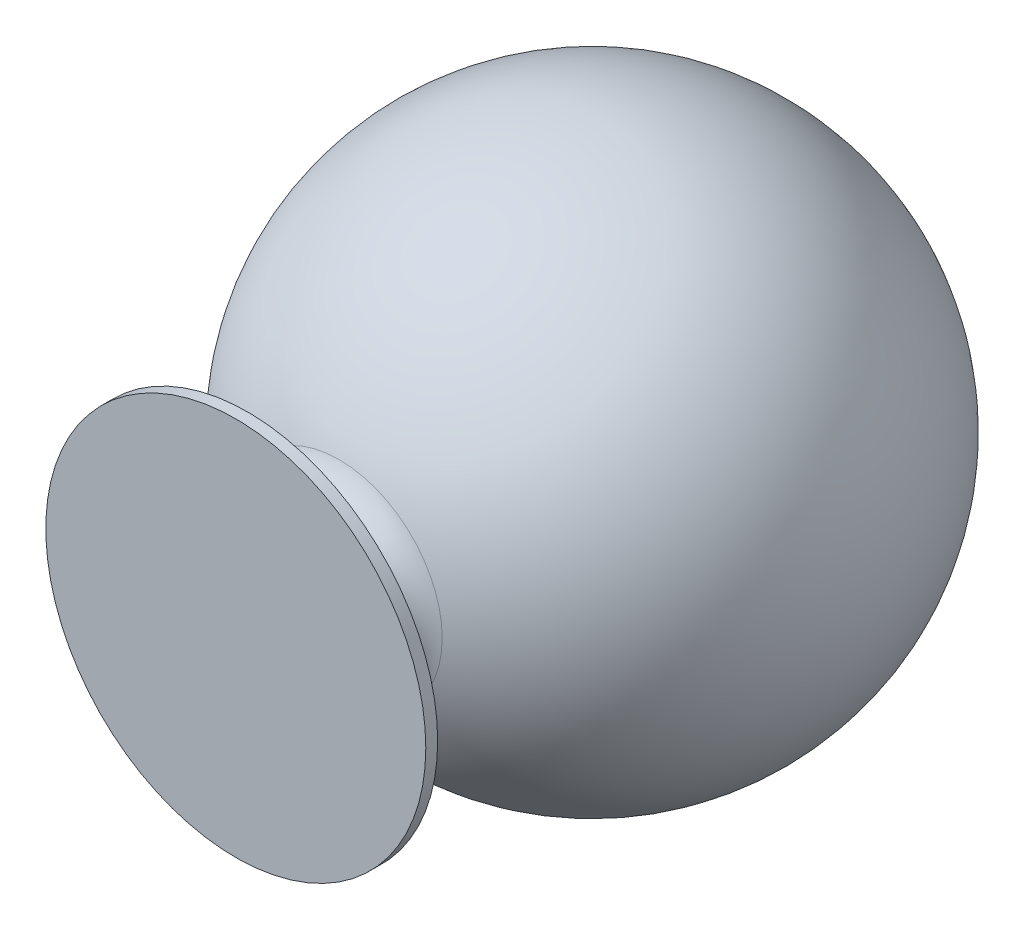
ISO-10303-21;
HEADER;
FILE_DESCRIPTION(('STEP AP214'),'2;1');
FILE_NAME('part.step','',(''),(''),'','','');
FILE_SCHEMA(('AUTOMOTIVE_DESIGN { 1 0 10303 214 1 1 1 1 }'));
ENDSEC;
DATA;
#1=APPLICATION_CONTEXT('core data for automotive mechanical design processes');
#2=APPLICATION_PROTOCOL_DEFINITION('international standard','automotive_design',2000,#1);
#3=PRODUCT_CONTEXT('',#1,'mechanical');
#4=PRODUCT('Part','Part','',(#3));
#5=PRODUCT_RELATED_PRODUCT_CATEGORY('part','',(#4));
#6=PRODUCT_DEFINITION_FORMATION('','',#4);
#7=PRODUCT_DEFINITION_CONTEXT('part definition',#1,'design');
#8=PRODUCT_DEFINITION('design','',#6,#7);
#9=PRODUCT_DEFINITION_SHAPE('','',#8);
#10=(LENGTH_UNIT() NAMED_UNIT(*) SI_UNIT(.MILLI.,.METRE.));
#11=(NAMED_UNIT(*) PLANE_ANGLE_UNIT() SI_UNIT($,.RADIAN.));
#12=(NAMED_UNIT(*) SI_UNIT($,.STERADIAN.) SOLID_ANGLE_UNIT());
#13=UNCERTAINTY_MEASURE_WITH_UNIT(LENGTH_MEASURE(1.E-05),#10,'distance_accuracy_value','');
#14=(GEOMETRIC_REPRESENTATION_CONTEXT(3) GLOBAL_UNCERTAINTY_ASSIGNED_CONTEXT((#13)) GLOBAL_UNIT_ASSIGNED_CONTEXT((#10,
#11,#12)) REPRESENTATION_CONTEXT('',''));
#15=CARTESIAN_POINT('',(0.,0.,0.));
#16=DIRECTION('',(0.,0.,1.));
#17=DIRECTION('',(1.,0.,0.));
#18=AXIS2_PLACEMENT_3D('',#15,#16,#17);
#19=CARTESIAN_POINT('',(0.,0.,0.));
#20=DIRECTION('',(0.,0.,1.));
#21=DIRECTION('',(-1.,0.,0.));
#22=AXIS2_PLACEMENT_3D('',#19,#20,#21);
#23=SPHERICAL_SURFACE('',#22,23.);
#24=CARTESIAN_POINT('',(0.,0.,21.2995469744592));
#25=DIRECTION('',(0.,0.,1.));
#26=DIRECTION('',(1.,0.,0.));
#27=AXIS2_PLACEMENT_3D('',#24,#25,#26);
#28=CIRCLE('',#27,8.67924528301887);
#29=CARTESIAN_POINT('',(8.67924528301887,0.,21.2995469744592));
#30=VERTEX_POINT('',#29);
#31=EDGE_CURVE('E10',#30,#30,#28,.T.);
#32=ORIENTED_EDGE('',*,*,#31,.F.);
#33=EDGE_LOOP('',(#32));
#34=FACE_BOUND('',#33,.T.);
#35=ADVANCED_FACE('F29',(#34),#23,.T.);
#36=CARTESIAN_POINT('',(0.,0.,24.5407823836161));
#37=DIRECTION('',(0.,0.,1.));
#38=DIRECTION('',(1.,0.,0.));
#39=AXIS2_PLACEMENT_3D('',#36,#37,#38);
#40=TOROIDAL_SURFACE('',#39,10.,3.5);
#41=CARTESIAN_POINT('',(0.,0.,27.8663329828295));
#42=DIRECTION('',(0.,0.,1.));
#43=DIRECTION('',(1.,0.,0.));
#44=AXIS2_PLACEMENT_3D('',#41,#42,#43);
#45=CIRCLE('',#44,8.90880193728576);
#46=CARTESIAN_POINT('',(8.90880193728576,0.,27.8663329828295));
#47=VERTEX_POINT('',#46);
#48=EDGE_CURVE('E35',#47,#47,#45,.T.);
#49=ORIENTED_EDGE('',*,*,#48,.F.);
#50=EDGE_LOOP('',(#49));
#51=FACE_BOUND('',#50,.T.);
#52=ORIENTED_EDGE('',*,*,#31,.T.);
#53=EDGE_LOOP('',(#52));
#54=FACE_BOUND('',#53,.T.);
#55=ADVANCED_FACE('F59',(#51,#54),#40,.F.);
#56=CARTESIAN_POINT('',(0.,0.,6.25509779795185));
#57=DIRECTION('',(0.,0.,1.));
#58=DIRECTION('',(1.,0.,0.));
#59=AXIS2_PLACEMENT_3D('',#56,#57,#58);
#60=DEGENERATE_TOROIDAL_SURFACE('',#59,16.,22.7449022020481,.T.);
#61=CARTESIAN_POINT('',(0.,0.,29.));
#62=DIRECTION('',(0.,0.,1.));
#63=DIRECTION('',(1.,0.,0.));
#64=AXIS2_PLACEMENT_3D('',#61,#62,#63);
#65=CIRCLE('',#64,16.);
#66=CARTESIAN_POINT('',(16.,0.,29.));
#67=VERTEX_POINT('',#66);
#68=EDGE_CURVE('E39',#67,#67,#65,.T.);
#69=ORIENTED_EDGE('',*,*,#68,.F.);
#70=EDGE_LOOP('',(#69));
#71=FACE_BOUND('',#70,.T.);
#72=ORIENTED_EDGE('',*,*,#48,.T.);
#73=EDGE_LOOP('',(#72));
#74=FACE_BOUND('',#73,.T.);
#75=ADVANCED_FACE('F54',(#71,#74),#60,.F.);
#76=CARTESIAN_POINT('',(0.,0.,29.938830715533));
#77=DIRECTION('',(0.,0.,1.));
#78=DIRECTION('',(1.,0.,0.));
#79=AXIS2_PLACEMENT_3D('',#76,#77,#78);
#80=CYLINDRICAL_SURFACE('',#79,16.);
#81=CARTESIAN_POINT('',(0.,0.,30.));
#82=DIRECTION('',(0.,0.,1.));
#83=DIRECTION('',(1.,0.,0.));
#84=AXIS2_PLACEMENT_3D('',#81,#82,#83);
#85=CIRCLE('',#84,16.);
#86=CARTESIAN_POINT('',(16.,0.,30.));
#87=VERTEX_POINT('',#86);
#88=EDGE_CURVE('E43',#87,#87,#85,.T.);
#89=ORIENTED_EDGE('',*,*,#88,.F.);
#90=EDGE_LOOP('',(#89));
#91=FACE_BOUND('',#90,.T.);
#92=ORIENTED_EDGE('',*,*,#68,.T.);
#93=EDGE_LOOP('',(#92));
#94=FACE_BOUND('',#93,.T.);
#95=ADVANCED_FACE('F51',(#91,#94),#80,.T.);
#96=CARTESIAN_POINT('',(-16.,0.,30.));
#97=DIRECTION('',(0.,0.,-1.));
#98=DIRECTION('',(-1.,0.,0.));
#99=AXIS2_PLACEMENT_3D('',#96,#97,#98);
#100=PLANE('',#99);
#101=ORIENTED_EDGE('',*,*,#88,.T.);
#102=EDGE_LOOP('',(#101));
#103=FACE_BOUND('',#102,.T.);
#104=ADVANCED_FACE('F49',(#103),#100,.F.);
#105=CLOSED_SHELL('',(#35,#55,#75,#95,#104));
#106=MANIFOLD_SOLID_BREP('B2',#105);
#107=ADVANCED_BREP_SHAPE_REPRESENTATION('',(#18,#106),#14);
#108=SHAPE_DEFINITION_REPRESENTATION(#9,#107);
ENDSEC;
END-ISO-10303-21;
